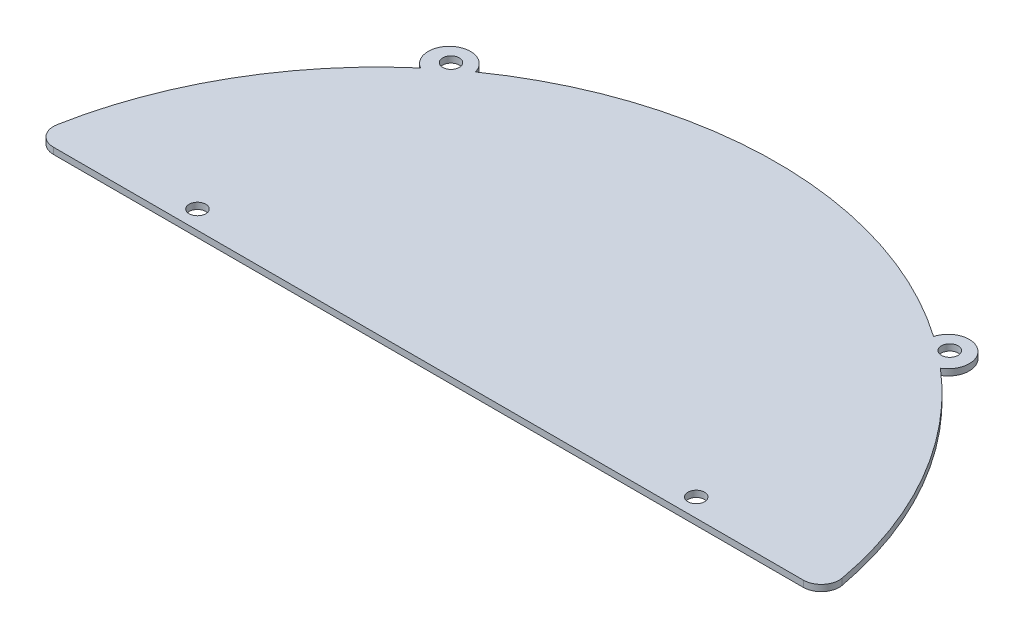
ISO-10303-21;
HEADER;
FILE_DESCRIPTION(('STEP AP214'),'2;1');
FILE_NAME('part.step','',(''),(''),'','','');
FILE_SCHEMA(('AUTOMOTIVE_DESIGN { 1 0 10303 214 1 1 1 1 }'));
ENDSEC;
DATA;
#1=APPLICATION_CONTEXT('core data for automotive mechanical design processes');
#2=APPLICATION_PROTOCOL_DEFINITION('international standard','automotive_design',2000,#1);
#3=PRODUCT_CONTEXT('',#1,'mechanical');
#4=PRODUCT('Part','Part','',(#3));
#5=PRODUCT_RELATED_PRODUCT_CATEGORY('part','',(#4));
#6=PRODUCT_DEFINITION_FORMATION('','',#4);
#7=PRODUCT_DEFINITION_CONTEXT('part definition',#1,'design');
#8=PRODUCT_DEFINITION('design','',#6,#7);
#9=PRODUCT_DEFINITION_SHAPE('','',#8);
#10=(LENGTH_UNIT() NAMED_UNIT(*) SI_UNIT(.MILLI.,.METRE.));
#11=(NAMED_UNIT(*) PLANE_ANGLE_UNIT() SI_UNIT($,.RADIAN.));
#12=(NAMED_UNIT(*) SI_UNIT($,.STERADIAN.) SOLID_ANGLE_UNIT());
#13=UNCERTAINTY_MEASURE_WITH_UNIT(LENGTH_MEASURE(1.E-05),#10,'distance_accuracy_value','');
#14=(GEOMETRIC_REPRESENTATION_CONTEXT(3) GLOBAL_UNCERTAINTY_ASSIGNED_CONTEXT((#13)) GLOBAL_UNIT_ASSIGNED_CONTEXT((#10,
#11,#12)) REPRESENTATION_CONTEXT('',''));
#15=CARTESIAN_POINT('',(0.,0.,0.));
#16=DIRECTION('',(0.,0.,1.));
#17=DIRECTION('',(1.,0.,0.));
#18=AXIS2_PLACEMENT_3D('',#15,#16,#17);
#19=CARTESIAN_POINT('',(0.,1.524,12.2093181818182));
#20=DIRECTION('',(0.,-1.,0.));
#21=DIRECTION('',(0.,0.,-1.));
#22=AXIS2_PLACEMENT_3D('',#19,#20,#21);
#23=CYLINDRICAL_SURFACE('',#22,96.0293181818182);
#24=DIRECTION('',(0.,1.,0.));
#25=VECTOR('',#24,1.);
#26=CARTESIAN_POINT('',(-62.5462288774261,-13.7542640313943,-60.6576784879877));
#27=LINE('',#26,#25);
#28=CARTESIAN_POINT('',(-62.5462288774262,0.,-60.6576784879876));
#29=VERTEX_POINT('',#28);
#30=CARTESIAN_POINT('',(-62.5462288774262,1.524,-60.6576784879876));
#31=VERTEX_POINT('',#30);
#32=EDGE_CURVE('E158',#29,#31,#27,.T.);
#33=ORIENTED_EDGE('',*,*,#32,.F.);
#34=CARTESIAN_POINT('',(0.,0.,12.2093181818182));
#35=DIRECTION('',(0.,-1.,0.));
#36=DIRECTION('',(0.,0.,-1.));
#37=AXIS2_PLACEMENT_3D('',#34,#35,#36);
#38=CIRCLE('',#37,96.0293181818182);
#39=CARTESIAN_POINT('',(-94.4571373578081,0.,-5.09614779379366));
#40=VERTEX_POINT('',#39);
#41=EDGE_CURVE('E132',#40,#29,#38,.T.);
#42=ORIENTED_EDGE('',*,*,#41,.F.);
#43=DIRECTION('',(0.,-1.,0.));
#44=VECTOR('',#43,1.);
#45=CARTESIAN_POINT('',(-94.457137357808,1.524,-5.09614779379366));
#46=LINE('',#45,#44);
#47=CARTESIAN_POINT('',(-94.4571373578081,1.524,-5.09614779379366));
#48=VERTEX_POINT('',#47);
#49=EDGE_CURVE('E179',#40,#48,#46,.F.);
#50=ORIENTED_EDGE('',*,*,#49,.T.);
#51=CARTESIAN_POINT('',(0.,1.524,12.2093181818182));
#52=DIRECTION('',(0.,-1.,0.));
#53=DIRECTION('',(0.,0.,-1.));
#54=AXIS2_PLACEMENT_3D('',#51,#52,#53);
#55=CIRCLE('',#54,96.0293181818182);
#56=EDGE_CURVE('E83',#48,#31,#55,.T.);
#57=ORIENTED_EDGE('',*,*,#56,.T.);
#58=EDGE_LOOP('',(#33,#42,#50,#57));
#59=FACE_BOUND('',#58,.T.);
#60=ADVANCED_FACE('F59',(#59),#23,.T.);
#61=DIRECTION('',(0.,1.,0.));
#62=VECTOR('',#61,1.);
#63=CARTESIAN_POINT('',(62.5462288774265,-13.7542640313943,-60.6576784879874));
#64=LINE('',#63,#62);
#65=CARTESIAN_POINT('',(62.5462288774264,0.,-60.6576784879875));
#66=VERTEX_POINT('',#65);
#67=CARTESIAN_POINT('',(62.5462288774265,1.524,-60.6576784879874));
#68=VERTEX_POINT('',#67);
#69=EDGE_CURVE('E168',#66,#68,#64,.T.);
#70=ORIENTED_EDGE('',*,*,#69,.T.);
#71=CARTESIAN_POINT('',(94.4571373578081,1.524,-5.0961477937937));
#72=VERTEX_POINT('',#71);
#73=EDGE_CURVE('E176',#68,#72,#55,.T.);
#74=ORIENTED_EDGE('',*,*,#73,.T.);
#75=DIRECTION('',(0.,-1.,0.));
#76=VECTOR('',#75,1.);
#77=CARTESIAN_POINT('',(94.457137357808,1.524,-5.0961477937937));
#78=LINE('',#77,#76);
#79=CARTESIAN_POINT('',(94.4571373578081,0.,-5.0961477937937));
#80=VERTEX_POINT('',#79);
#81=EDGE_CURVE('E188',#72,#80,#78,.T.);
#82=ORIENTED_EDGE('',*,*,#81,.T.);
#83=EDGE_CURVE('E133',#66,#80,#38,.T.);
#84=ORIENTED_EDGE('',*,*,#83,.F.);
#85=EDGE_LOOP('',(#70,#74,#82,#84));
#86=FACE_BOUND('',#85,.T.);
#87=ADVANCED_FACE('F271',(#86),#23,.T.);
#88=DIRECTION('',(0.,1.,0.));
#89=VECTOR('',#88,1.);
#90=CARTESIAN_POINT('',(-55.1106037191574,-13.7542640313943,-66.4319642859472));
#91=LINE('',#90,#89);
#92=CARTESIAN_POINT('',(-55.1106037191574,0.,-66.4319642859472));
#93=VERTEX_POINT('',#92);
#94=CARTESIAN_POINT('',(-55.1106037191573,1.524,-66.4319642859473));
#95=VERTEX_POINT('',#94);
#96=EDGE_CURVE('E75',#93,#95,#91,.T.);
#97=ORIENTED_EDGE('',*,*,#96,.T.);
#98=CARTESIAN_POINT('',(55.1106037191574,1.524,-66.4319642859472));
#99=VERTEX_POINT('',#98);
#100=EDGE_CURVE('E175',#95,#99,#55,.T.);
#101=ORIENTED_EDGE('',*,*,#100,.T.);
#102=DIRECTION('',(0.,1.,0.));
#103=VECTOR('',#102,1.);
#104=CARTESIAN_POINT('',(55.1106037191574,-13.7542640313943,-66.4319642859472));
#105=LINE('',#104,#103);
#106=CARTESIAN_POINT('',(55.1106037191574,0.,-66.4319642859472));
#107=VERTEX_POINT('',#106);
#108=EDGE_CURVE('E126',#107,#99,#105,.T.);
#109=ORIENTED_EDGE('',*,*,#108,.F.);
#110=EDGE_CURVE('E123',#93,#107,#38,.T.);
#111=ORIENTED_EDGE('',*,*,#110,.F.);
#112=EDGE_LOOP('',(#97,#101,#109,#111));
#113=FACE_BOUND('',#112,.T.);
#114=ADVANCED_FACE('F124',(#113),#23,.T.);
#115=CARTESIAN_POINT('',(-95.25,1.524,0.));
#116=DIRECTION('',(0.,0.,-1.));
#117=DIRECTION('',(-1.,0.,0.));
#118=AXIS2_PLACEMENT_3D('',#115,#116,#117);
#119=PLANE('',#118);
#120=DIRECTION('',(1.,0.,0.));
#121=VECTOR('',#120,1.);
#122=CARTESIAN_POINT('',(-95.25,0.,0.));
#123=LINE('',#122,#121);
#124=CARTESIAN_POINT('',(-90.2098311513974,0.,0.));
#125=VERTEX_POINT('',#124);
#126=CARTESIAN_POINT('',(90.2098311513974,0.,0.));
#127=VERTEX_POINT('',#126);
#128=EDGE_CURVE('E182',#125,#127,#123,.T.);
#129=ORIENTED_EDGE('',*,*,#128,.T.);
#130=DIRECTION('',(0.,1.,0.));
#131=VECTOR('',#130,1.);
#132=CARTESIAN_POINT('',(90.2098311513974,1.524,0.));
#133=LINE('',#132,#131);
#134=CARTESIAN_POINT('',(90.2098311513974,1.524,0.));
#135=VERTEX_POINT('',#134);
#136=EDGE_CURVE('E202',#127,#135,#133,.T.);
#137=ORIENTED_EDGE('',*,*,#136,.T.);
#138=DIRECTION('',(1.,0.,0.));
#139=VECTOR('',#138,1.);
#140=CARTESIAN_POINT('',(-95.25,1.524,0.));
#141=LINE('',#140,#139);
#142=CARTESIAN_POINT('',(-90.2098311513974,1.524,0.));
#143=VERTEX_POINT('',#142);
#144=EDGE_CURVE('E174',#143,#135,#141,.T.);
#145=ORIENTED_EDGE('',*,*,#144,.F.);
#146=DIRECTION('',(0.,1.,0.));
#147=VECTOR('',#146,1.);
#148=CARTESIAN_POINT('',(-90.2098311513974,0.,0.));
#149=LINE('',#148,#147);
#150=EDGE_CURVE('E198',#143,#125,#149,.F.);
#151=ORIENTED_EDGE('',*,*,#150,.T.);
#152=EDGE_LOOP('',(#129,#137,#145,#151));
#153=FACE_BOUND('',#152,.T.);
#154=ADVANCED_FACE('F214',(#153),#119,.F.);
#155=CARTESIAN_POINT('',(0.,1.524,12.2093181818182));
#156=DIRECTION('',(0.,-1.,0.));
#157=DIRECTION('',(0.,0.,-1.));
#158=AXIS2_PLACEMENT_3D('',#155,#156,#157);
#159=PLANE('',#158);
#160=CARTESIAN_POINT('',(60.,1.524,-65.4450000000001));
#161=DIRECTION('',(0.,1.,0.));
#162=DIRECTION('',(0.,0.,-1.));
#163=AXIS2_PLACEMENT_3D('',#160,#161,#162);
#164=CIRCLE('',#163,2.);
#165=CARTESIAN_POINT('',(60.,1.524,-63.4450000000001));
#166=VERTEX_POINT('',#165);
#167=EDGE_CURVE('E227',#166,#166,#164,.T.);
#168=ORIENTED_EDGE('',*,*,#167,.F.);
#169=EDGE_LOOP('',(#168));
#170=FACE_BOUND('',#169,.T.);
#171=CARTESIAN_POINT('',(-60.,1.524,-4.44500000000005));
#172=DIRECTION('',(0.,1.,0.));
#173=DIRECTION('',(0.,0.,-1.));
#174=AXIS2_PLACEMENT_3D('',#171,#172,#173);
#175=CIRCLE('',#174,2.);
#176=CARTESIAN_POINT('',(-60.,1.524,-2.44500000000004));
#177=VERTEX_POINT('',#176);
#178=EDGE_CURVE('E235',#177,#177,#175,.T.);
#179=ORIENTED_EDGE('',*,*,#178,.F.);
#180=EDGE_LOOP('',(#179));
#181=FACE_BOUND('',#180,.T.);
#182=CARTESIAN_POINT('',(60.,1.524,-4.44500000000006));
#183=DIRECTION('',(0.,1.,0.));
#184=DIRECTION('',(0.,0.,1.));
#185=AXIS2_PLACEMENT_3D('',#182,#183,#184);
#186=CIRCLE('',#185,2.);
#187=CARTESIAN_POINT('',(60.,1.524,-2.44500000000006));
#188=VERTEX_POINT('',#187);
#189=EDGE_CURVE('E221',#188,#188,#186,.T.);
#190=ORIENTED_EDGE('',*,*,#189,.F.);
#191=EDGE_LOOP('',(#190));
#192=FACE_BOUND('',#191,.T.);
#193=CARTESIAN_POINT('',(-60.,1.524,-65.4450000000001));
#194=DIRECTION('',(0.,1.,0.));
#195=DIRECTION('',(0.,0.,1.));
#196=AXIS2_PLACEMENT_3D('',#193,#194,#195);
#197=CIRCLE('',#196,2.);
#198=CARTESIAN_POINT('',(-60.,1.524,-63.445));
#199=VERTEX_POINT('',#198);
#200=EDGE_CURVE('E152',#199,#199,#197,.T.);
#201=ORIENTED_EDGE('',*,*,#200,.F.);
#202=EDGE_LOOP('',(#201));
#203=FACE_BOUND('',#202,.T.);
#204=ORIENTED_EDGE('',*,*,#100,.F.);
#205=CARTESIAN_POINT('',(-60.,1.524,-65.0534854109267));
#206=DIRECTION('',(0.,1.,0.));
#207=DIRECTION('',(0.,0.,1.));
#208=AXIS2_PLACEMENT_3D('',#205,#206,#207);
#209=CIRCLE('',#208,5.08);
#210=EDGE_CURVE('E141',#31,#95,#209,.F.);
#211=ORIENTED_EDGE('',*,*,#210,.F.);
#212=ORIENTED_EDGE('',*,*,#56,.F.);
#213=CARTESIAN_POINT('',(-90.2098311513974,1.524,-4.31799999999999));
#214=DIRECTION('',(0.,-1.,0.));
#215=DIRECTION('',(0.,0.,-1.));
#216=AXIS2_PLACEMENT_3D('',#213,#214,#215);
#217=CIRCLE('',#216,4.318);
#218=EDGE_CURVE('E68',#48,#143,#217,.F.);
#219=ORIENTED_EDGE('',*,*,#218,.T.);
#220=ORIENTED_EDGE('',*,*,#144,.T.);
#221=CARTESIAN_POINT('',(90.2098311513974,1.524,-4.31800000000003));
#222=DIRECTION('',(0.,-1.,0.));
#223=DIRECTION('',(0.,0.,-1.));
#224=AXIS2_PLACEMENT_3D('',#221,#222,#223);
#225=CIRCLE('',#224,4.318);
#226=EDGE_CURVE('E12',#135,#72,#225,.F.);
#227=ORIENTED_EDGE('',*,*,#226,.T.);
#228=ORIENTED_EDGE('',*,*,#73,.F.);
#229=CARTESIAN_POINT('',(60.,1.524,-65.0534854109267));
#230=DIRECTION('',(0.,1.,0.));
#231=DIRECTION('',(0.,0.,1.));
#232=AXIS2_PLACEMENT_3D('',#229,#230,#231);
#233=CIRCLE('',#232,5.08);
#234=EDGE_CURVE('E159',#68,#99,#233,.T.);
#235=ORIENTED_EDGE('',*,*,#234,.T.);
#236=EDGE_LOOP('',(#204,#211,#212,#219,#220,#227,#228,#235));
#237=FACE_BOUND('',#236,.T.);
#238=ADVANCED_FACE('F208',(#170,#181,#192,#203,#237),#159,.F.);
#239=CARTESIAN_POINT('',(0.,0.,12.2093181818182));
#240=DIRECTION('',(0.,-1.,0.));
#241=DIRECTION('',(0.,0.,-1.));
#242=AXIS2_PLACEMENT_3D('',#239,#240,#241);
#243=PLANE('',#242);
#244=CARTESIAN_POINT('',(60.,0.,-65.4450000000001));
#245=DIRECTION('',(0.,1.,0.));
#246=DIRECTION('',(0.,0.,-1.));
#247=AXIS2_PLACEMENT_3D('',#244,#245,#246);
#248=CIRCLE('',#247,2.);
#249=CARTESIAN_POINT('',(60.,0.,-63.4450000000001));
#250=VERTEX_POINT('',#249);
#251=EDGE_CURVE('E223',#250,#250,#248,.T.);
#252=ORIENTED_EDGE('',*,*,#251,.T.);
#253=EDGE_LOOP('',(#252));
#254=FACE_BOUND('',#253,.T.);
#255=CARTESIAN_POINT('',(-60.,0.,-4.44500000000005));
#256=DIRECTION('',(0.,1.,0.));
#257=DIRECTION('',(0.,0.,-1.));
#258=AXIS2_PLACEMENT_3D('',#255,#256,#257);
#259=CIRCLE('',#258,2.);
#260=CARTESIAN_POINT('',(-60.,0.,-2.44500000000004));
#261=VERTEX_POINT('',#260);
#262=EDGE_CURVE('E231',#261,#261,#259,.T.);
#263=ORIENTED_EDGE('',*,*,#262,.T.);
#264=EDGE_LOOP('',(#263));
#265=FACE_BOUND('',#264,.T.);
#266=CARTESIAN_POINT('',(60.,0.,-4.44500000000006));
#267=DIRECTION('',(0.,1.,0.));
#268=DIRECTION('',(0.,0.,1.));
#269=AXIS2_PLACEMENT_3D('',#266,#267,#268);
#270=CIRCLE('',#269,2.);
#271=CARTESIAN_POINT('',(60.,0.,-2.44500000000006));
#272=VERTEX_POINT('',#271);
#273=EDGE_CURVE('E239',#272,#272,#270,.T.);
#274=ORIENTED_EDGE('',*,*,#273,.T.);
#275=EDGE_LOOP('',(#274));
#276=FACE_BOUND('',#275,.T.);
#277=CARTESIAN_POINT('',(-60.,0.,-65.4450000000001));
#278=DIRECTION('',(0.,1.,0.));
#279=DIRECTION('',(0.,0.,1.));
#280=AXIS2_PLACEMENT_3D('',#277,#278,#279);
#281=CIRCLE('',#280,2.);
#282=CARTESIAN_POINT('',(-60.,0.,-63.445));
#283=VERTEX_POINT('',#282);
#284=EDGE_CURVE('E148',#283,#283,#281,.T.);
#285=ORIENTED_EDGE('',*,*,#284,.T.);
#286=EDGE_LOOP('',(#285));
#287=FACE_BOUND('',#286,.T.);
#288=ORIENTED_EDGE('',*,*,#41,.T.);
#289=CARTESIAN_POINT('',(-60.,0.,-65.0534854109267));
#290=DIRECTION('',(0.,-1.,0.));
#291=DIRECTION('',(0.,0.,-1.));
#292=AXIS2_PLACEMENT_3D('',#289,#290,#291);
#293=CIRCLE('',#292,5.08);
#294=EDGE_CURVE('E139',#29,#93,#293,.T.);
#295=ORIENTED_EDGE('',*,*,#294,.T.);
#296=ORIENTED_EDGE('',*,*,#110,.T.);
#297=CARTESIAN_POINT('',(60.,0.,-65.0534854109267));
#298=DIRECTION('',(0.,-1.,0.));
#299=DIRECTION('',(0.,0.,-1.));
#300=AXIS2_PLACEMENT_3D('',#297,#298,#299);
#301=CIRCLE('',#300,5.08);
#302=EDGE_CURVE('E163',#66,#107,#301,.F.);
#303=ORIENTED_EDGE('',*,*,#302,.F.);
#304=ORIENTED_EDGE('',*,*,#83,.T.);
#305=CARTESIAN_POINT('',(90.2098311513974,0.,-4.31800000000003));
#306=DIRECTION('',(0.,-1.,0.));
#307=DIRECTION('',(0.,0.,-1.));
#308=AXIS2_PLACEMENT_3D('',#305,#306,#307);
#309=CIRCLE('',#308,4.318);
#310=EDGE_CURVE('E195',#80,#127,#309,.T.);
#311=ORIENTED_EDGE('',*,*,#310,.T.);
#312=ORIENTED_EDGE('',*,*,#128,.F.);
#313=CARTESIAN_POINT('',(-90.2098311513974,0.,-4.31799999999999));
#314=DIRECTION('',(0.,-1.,0.));
#315=DIRECTION('',(0.,0.,-1.));
#316=AXIS2_PLACEMENT_3D('',#313,#314,#315);
#317=CIRCLE('',#316,4.318);
#318=EDGE_CURVE('E192',#125,#40,#317,.T.);
#319=ORIENTED_EDGE('',*,*,#318,.T.);
#320=EDGE_LOOP('',(#288,#295,#296,#303,#304,#311,#312,#319));
#321=FACE_BOUND('',#320,.T.);
#322=ADVANCED_FACE('F145',(#254,#265,#276,#287,#321),#243,.T.);
#323=CARTESIAN_POINT('',(90.2098311513974,1.524,-4.31800000000003));
#324=DIRECTION('',(0.,-1.,0.));
#325=DIRECTION('',(0.,0.,-1.));
#326=AXIS2_PLACEMENT_3D('',#323,#324,#325);
#327=CYLINDRICAL_SURFACE('',#326,4.318);
#328=ORIENTED_EDGE('',*,*,#226,.F.);
#329=ORIENTED_EDGE('',*,*,#136,.F.);
#330=ORIENTED_EDGE('',*,*,#310,.F.);
#331=ORIENTED_EDGE('',*,*,#81,.F.);
#332=EDGE_LOOP('',(#328,#329,#330,#331));
#333=FACE_BOUND('',#332,.T.);
#334=ADVANCED_FACE('F286',(#333),#327,.T.);
#335=CARTESIAN_POINT('',(-90.2098311513974,1.524,-4.31799999999999));
#336=DIRECTION('',(0.,-1.,0.));
#337=DIRECTION('',(0.,0.,-1.));
#338=AXIS2_PLACEMENT_3D('',#335,#336,#337);
#339=CYLINDRICAL_SURFACE('',#338,4.318);
#340=ORIENTED_EDGE('',*,*,#218,.F.);
#341=ORIENTED_EDGE('',*,*,#49,.F.);
#342=ORIENTED_EDGE('',*,*,#318,.F.);
#343=ORIENTED_EDGE('',*,*,#150,.F.);
#344=EDGE_LOOP('',(#340,#341,#342,#343));
#345=FACE_BOUND('',#344,.T.);
#346=ADVANCED_FACE('F61',(#345),#339,.T.);
#347=CARTESIAN_POINT('',(60.,-13.7542640313943,-65.0534854109267));
#348=DIRECTION('',(0.,1.,0.));
#349=DIRECTION('',(0.,0.,1.));
#350=AXIS2_PLACEMENT_3D('',#347,#348,#349);
#351=CYLINDRICAL_SURFACE('',#350,5.08);
#352=ORIENTED_EDGE('',*,*,#69,.F.);
#353=ORIENTED_EDGE('',*,*,#302,.T.);
#354=ORIENTED_EDGE('',*,*,#108,.T.);
#355=ORIENTED_EDGE('',*,*,#234,.F.);
#356=EDGE_LOOP('',(#352,#353,#354,#355));
#357=FACE_BOUND('',#356,.T.);
#358=ADVANCED_FACE('F266',(#357),#351,.T.);
#359=CARTESIAN_POINT('',(-60.,-13.7542640313943,-65.0534854109267));
#360=DIRECTION('',(0.,1.,0.));
#361=DIRECTION('',(0.,0.,1.));
#362=AXIS2_PLACEMENT_3D('',#359,#360,#361);
#363=CYLINDRICAL_SURFACE('',#362,5.08);
#364=ORIENTED_EDGE('',*,*,#294,.F.);
#365=ORIENTED_EDGE('',*,*,#32,.T.);
#366=ORIENTED_EDGE('',*,*,#210,.T.);
#367=ORIENTED_EDGE('',*,*,#96,.F.);
#368=EDGE_LOOP('',(#364,#365,#366,#367));
#369=FACE_BOUND('',#368,.T.);
#370=ADVANCED_FACE('F138',(#369),#363,.T.);
#371=CARTESIAN_POINT('',(-60.,0.,-65.4450000000001));
#372=DIRECTION('',(0.,1.,0.));
#373=DIRECTION('',(0.,0.,1.));
#374=AXIS2_PLACEMENT_3D('',#371,#372,#373);
#375=CYLINDRICAL_SURFACE('',#374,2.);
#376=CARTESIAN_POINT('',(-60.,0.,-63.445));
#377=CARTESIAN_POINT('',(-60.,0.015875,-63.445));
#378=CARTESIAN_POINT('',(-60.,0.03175,-63.445));
#379=CARTESIAN_POINT('',(-60.,0.0635,-63.445));
#380=CARTESIAN_POINT('',(-60.,0.079375,-63.445));
#381=CARTESIAN_POINT('',(-60.,0.111125,-63.445));
#382=CARTESIAN_POINT('',(-60.,0.127,-63.445));
#383=CARTESIAN_POINT('',(-60.,0.15875,-63.445));
#384=CARTESIAN_POINT('',(-60.,0.174625,-63.445));
#385=CARTESIAN_POINT('',(-60.,0.206375,-63.445));
#386=CARTESIAN_POINT('',(-60.,0.22225,-63.445));
#387=CARTESIAN_POINT('',(-60.,0.254,-63.445));
#388=CARTESIAN_POINT('',(-60.,0.269875,-63.445));
#389=CARTESIAN_POINT('',(-60.,0.301625,-63.445));
#390=CARTESIAN_POINT('',(-60.,0.3175,-63.445));
#391=CARTESIAN_POINT('',(-60.,0.34925,-63.445));
#392=CARTESIAN_POINT('',(-60.,0.365125,-63.445));
#393=CARTESIAN_POINT('',(-60.,0.396875,-63.445));
#394=CARTESIAN_POINT('',(-60.,0.41275,-63.445));
#395=CARTESIAN_POINT('',(-60.,0.4445,-63.445));
#396=CARTESIAN_POINT('',(-60.,0.460375,-63.445));
#397=CARTESIAN_POINT('',(-60.,0.492125,-63.445));
#398=CARTESIAN_POINT('',(-60.,0.508,-63.445));
#399=CARTESIAN_POINT('',(-60.,0.53975,-63.445));
#400=CARTESIAN_POINT('',(-60.,0.555625,-63.445));
#401=CARTESIAN_POINT('',(-60.,0.587375,-63.445));
#402=CARTESIAN_POINT('',(-60.,0.60325,-63.445));
#403=CARTESIAN_POINT('',(-60.,0.635,-63.445));
#404=CARTESIAN_POINT('',(-60.,0.650875,-63.445));
#405=CARTESIAN_POINT('',(-60.,0.682625,-63.445));
#406=CARTESIAN_POINT('',(-60.,0.6985,-63.445));
#407=CARTESIAN_POINT('',(-60.,0.73025,-63.445));
#408=CARTESIAN_POINT('',(-60.,0.746125,-63.445));
#409=CARTESIAN_POINT('',(-60.,0.777875,-63.445));
#410=CARTESIAN_POINT('',(-60.,0.79375,-63.445));
#411=CARTESIAN_POINT('',(-60.,0.8255,-63.445));
#412=CARTESIAN_POINT('',(-60.,0.841375,-63.445));
#413=CARTESIAN_POINT('',(-60.,0.873125,-63.445));
#414=CARTESIAN_POINT('',(-60.,0.889,-63.445));
#415=CARTESIAN_POINT('',(-60.,0.92075,-63.445));
#416=CARTESIAN_POINT('',(-60.,0.936625,-63.445));
#417=CARTESIAN_POINT('',(-60.,0.968375,-63.445));
#418=CARTESIAN_POINT('',(-60.,0.98425,-63.445));
#419=CARTESIAN_POINT('',(-60.,1.016,-63.445));
#420=CARTESIAN_POINT('',(-60.,1.031875,-63.445));
#421=CARTESIAN_POINT('',(-60.,1.063625,-63.445));
#422=CARTESIAN_POINT('',(-60.,1.0795,-63.445));
#423=CARTESIAN_POINT('',(-60.,1.11125,-63.445));
#424=CARTESIAN_POINT('',(-60.,1.127125,-63.445));
#425=CARTESIAN_POINT('',(-60.,1.158875,-63.445));
#426=CARTESIAN_POINT('',(-60.,1.17475,-63.445));
#427=CARTESIAN_POINT('',(-60.,1.2065,-63.445));
#428=CARTESIAN_POINT('',(-60.,1.222375,-63.445));
#429=CARTESIAN_POINT('',(-60.,1.254125,-63.445));
#430=CARTESIAN_POINT('',(-60.,1.27,-63.445));
#431=CARTESIAN_POINT('',(-60.,1.30175,-63.445));
#432=CARTESIAN_POINT('',(-60.,1.317625,-63.445));
#433=CARTESIAN_POINT('',(-60.,1.349375,-63.445));
#434=CARTESIAN_POINT('',(-60.,1.36525,-63.445));
#435=CARTESIAN_POINT('',(-60.,1.397,-63.445));
#436=CARTESIAN_POINT('',(-60.,1.412875,-63.445));
#437=CARTESIAN_POINT('',(-60.,1.444625,-63.445));
#438=CARTESIAN_POINT('',(-60.,1.4605,-63.445));
#439=CARTESIAN_POINT('',(-60.,1.49225,-63.445));
#440=CARTESIAN_POINT('',(-60.,1.508125,-63.445));
#441=CARTESIAN_POINT('',(-60.,1.524,-63.445));
#442=B_SPLINE_CURVE_WITH_KNOTS('',3,(#376,#377,#378,#379,#380,#381,#382,#383,#384,#385,#386,
#387,#388,#389,#390,#391,#392,#393,#394,#395,#396,#397,#398,#399,#400,#401,#402,#403,#404,#405,
#406,#407,#408,#409,#410,#411,#412,#413,#414,#415,#416,#417,#418,#419,#420,#421,#422,#423,#424,
#425,#426,#427,#428,#429,#430,#431,#432,#433,#434,#435,#436,#437,#438,#439,#440,#441),
.UNSPECIFIED.,.F.,.F.,(4,2,2,2,2,2,2,2,2,2,2,2,2,2,2,2,2,2,2,2,2,2,2,2,2,2,2,2,2,2,2,2,4),(0.,
0.047625,0.09525,0.142875,0.1905,0.238125,0.28575,0.333375,0.381,0.428625,0.47625,0.523875,
0.5715,0.619125,0.66675,0.714375,0.762,0.809625,0.85725,0.904875,0.9525,1.000125,1.04775,
1.095375,1.143,1.190625,1.23825,1.285875,1.3335,1.381125,1.42875,1.476375,1.524),.UNSPECIFIED.);
#443=EDGE_CURVE('BSEAM255',#283,#199,#442,.T.);
#444=ORIENTED_EDGE('',*,*,#284,.F.);
#445=ORIENTED_EDGE('',*,*,#200,.T.);
#446=ORIENTED_EDGE('',*,*,#443,.T.);
#447=ORIENTED_EDGE('',*,*,#443,.F.);
#448=EDGE_LOOP('',(#444,#446,#445,#447));
#449=FACE_BOUND('',#448,.T.);
#450=ADVANCED_FACE('F255',(#449),#375,.F.);
#451=CARTESIAN_POINT('',(60.,0.,-4.44500000000006));
#452=DIRECTION('',(0.,1.,0.));
#453=DIRECTION('',(0.,0.,1.));
#454=AXIS2_PLACEMENT_3D('',#451,#452,#453);
#455=CYLINDRICAL_SURFACE('',#454,2.);
#456=CARTESIAN_POINT('',(60.,0.,-2.44500000000006));
#457=CARTESIAN_POINT('',(60.,0.015875,-2.44500000000006));
#458=CARTESIAN_POINT('',(60.,0.03175,-2.44500000000006));
#459=CARTESIAN_POINT('',(60.,0.0635,-2.44500000000006));
#460=CARTESIAN_POINT('',(60.,0.079375,-2.44500000000006));
#461=CARTESIAN_POINT('',(60.,0.111125,-2.44500000000006));
#462=CARTESIAN_POINT('',(60.,0.127,-2.44500000000006));
#463=CARTESIAN_POINT('',(60.,0.15875,-2.44500000000006));
#464=CARTESIAN_POINT('',(60.,0.174625,-2.44500000000006));
#465=CARTESIAN_POINT('',(60.,0.206375,-2.44500000000006));
#466=CARTESIAN_POINT('',(60.,0.22225,-2.44500000000006));
#467=CARTESIAN_POINT('',(60.,0.254,-2.44500000000006));
#468=CARTESIAN_POINT('',(60.,0.269875,-2.44500000000006));
#469=CARTESIAN_POINT('',(60.,0.301625,-2.44500000000006));
#470=CARTESIAN_POINT('',(60.,0.3175,-2.44500000000006));
#471=CARTESIAN_POINT('',(60.,0.34925,-2.44500000000006));
#472=CARTESIAN_POINT('',(60.,0.365125,-2.44500000000006));
#473=CARTESIAN_POINT('',(60.,0.396875,-2.44500000000006));
#474=CARTESIAN_POINT('',(60.,0.41275,-2.44500000000006));
#475=CARTESIAN_POINT('',(60.,0.4445,-2.44500000000006));
#476=CARTESIAN_POINT('',(60.,0.460375,-2.44500000000006));
#477=CARTESIAN_POINT('',(60.,0.492125,-2.44500000000006));
#478=CARTESIAN_POINT('',(60.,0.508,-2.44500000000006));
#479=CARTESIAN_POINT('',(60.,0.53975,-2.44500000000006));
#480=CARTESIAN_POINT('',(60.,0.555625,-2.44500000000006));
#481=CARTESIAN_POINT('',(60.,0.587375,-2.44500000000006));
#482=CARTESIAN_POINT('',(60.,0.60325,-2.44500000000006));
#483=CARTESIAN_POINT('',(60.,0.635,-2.44500000000006));
#484=CARTESIAN_POINT('',(60.,0.650875,-2.44500000000006));
#485=CARTESIAN_POINT('',(60.,0.682625,-2.44500000000006));
#486=CARTESIAN_POINT('',(60.,0.6985,-2.44500000000006));
#487=CARTESIAN_POINT('',(60.,0.73025,-2.44500000000006));
#488=CARTESIAN_POINT('',(60.,0.746125,-2.44500000000006));
#489=CARTESIAN_POINT('',(60.,0.777875,-2.44500000000006));
#490=CARTESIAN_POINT('',(60.,0.79375,-2.44500000000006));
#491=CARTESIAN_POINT('',(60.,0.8255,-2.44500000000006));
#492=CARTESIAN_POINT('',(60.,0.841375,-2.44500000000006));
#493=CARTESIAN_POINT('',(60.,0.873125,-2.44500000000006));
#494=CARTESIAN_POINT('',(60.,0.889,-2.44500000000006));
#495=CARTESIAN_POINT('',(60.,0.92075,-2.44500000000006));
#496=CARTESIAN_POINT('',(60.,0.936625,-2.44500000000006));
#497=CARTESIAN_POINT('',(60.,0.968375,-2.44500000000006));
#498=CARTESIAN_POINT('',(60.,0.98425,-2.44500000000006));
#499=CARTESIAN_POINT('',(60.,1.016,-2.44500000000006));
#500=CARTESIAN_POINT('',(60.,1.031875,-2.44500000000006));
#501=CARTESIAN_POINT('',(60.,1.063625,-2.44500000000006));
#502=CARTESIAN_POINT('',(60.,1.0795,-2.44500000000006));
#503=CARTESIAN_POINT('',(60.,1.11125,-2.44500000000006));
#504=CARTESIAN_POINT('',(60.,1.127125,-2.44500000000006));
#505=CARTESIAN_POINT('',(60.,1.158875,-2.44500000000006));
#506=CARTESIAN_POINT('',(60.,1.17475,-2.44500000000006));
#507=CARTESIAN_POINT('',(60.,1.2065,-2.44500000000006));
#508=CARTESIAN_POINT('',(60.,1.222375,-2.44500000000006));
#509=CARTESIAN_POINT('',(60.,1.254125,-2.44500000000006));
#510=CARTESIAN_POINT('',(60.,1.27,-2.44500000000006));
#511=CARTESIAN_POINT('',(60.,1.30175,-2.44500000000006));
#512=CARTESIAN_POINT('',(60.,1.317625,-2.44500000000006));
#513=CARTESIAN_POINT('',(60.,1.349375,-2.44500000000006));
#514=CARTESIAN_POINT('',(60.,1.36525,-2.44500000000006));
#515=CARTESIAN_POINT('',(60.,1.397,-2.44500000000006));
#516=CARTESIAN_POINT('',(60.,1.412875,-2.44500000000006));
#517=CARTESIAN_POINT('',(60.,1.444625,-2.44500000000006));
#518=CARTESIAN_POINT('',(60.,1.4605,-2.44500000000006));
#519=CARTESIAN_POINT('',(60.,1.49225,-2.44500000000006));
#520=CARTESIAN_POINT('',(60.,1.508125,-2.44500000000006));
#521=CARTESIAN_POINT('',(60.,1.524,-2.44500000000006));
#522=B_SPLINE_CURVE_WITH_KNOTS('',3,(#456,#457,#458,#459,#460,#461,#462,#463,#464,#465,#466,
#467,#468,#469,#470,#471,#472,#473,#474,#475,#476,#477,#478,#479,#480,#481,#482,#483,#484,#485,
#486,#487,#488,#489,#490,#491,#492,#493,#494,#495,#496,#497,#498,#499,#500,#501,#502,#503,#504,
#505,#506,#507,#508,#509,#510,#511,#512,#513,#514,#515,#516,#517,#518,#519,#520,#521),
.UNSPECIFIED.,.F.,.F.,(4,2,2,2,2,2,2,2,2,2,2,2,2,2,2,2,2,2,2,2,2,2,2,2,2,2,2,2,2,2,2,2,4),(0.,
0.047625,0.09525,0.142875,0.1905,0.238125,0.28575,0.333375,0.381,0.428625,0.47625,0.523875,
0.5715,0.619125,0.66675,0.714375,0.762,0.809625,0.85725,0.904875,0.9525,1.000125,1.04775,
1.095375,1.143,1.190625,1.23825,1.285875,1.3335,1.381125,1.42875,1.476375,1.524),.UNSPECIFIED.);
#523=EDGE_CURVE('BSEAM247',#272,#188,#522,.T.);
#524=ORIENTED_EDGE('',*,*,#273,.F.);
#525=ORIENTED_EDGE('',*,*,#189,.T.);
#526=ORIENTED_EDGE('',*,*,#523,.T.);
#527=ORIENTED_EDGE('',*,*,#523,.F.);
#528=EDGE_LOOP('',(#524,#526,#525,#527));
#529=FACE_BOUND('',#528,.T.);
#530=ADVANCED_FACE('F247',(#529),#455,.F.);
#531=CARTESIAN_POINT('',(-60.,0.,-4.44500000000005));
#532=DIRECTION('',(0.,1.,0.));
#533=DIRECTION('',(0.,0.,1.));
#534=AXIS2_PLACEMENT_3D('',#531,#532,#533);
#535=CYLINDRICAL_SURFACE('',#534,2.);
#536=CARTESIAN_POINT('',(-60.,0.,-2.44500000000004));
#537=CARTESIAN_POINT('',(-60.,0.015875,-2.44500000000004));
#538=CARTESIAN_POINT('',(-60.,0.03175,-2.44500000000004));
#539=CARTESIAN_POINT('',(-60.,0.0635,-2.44500000000004));
#540=CARTESIAN_POINT('',(-60.,0.079375,-2.44500000000004));
#541=CARTESIAN_POINT('',(-60.,0.111125,-2.44500000000004));
#542=CARTESIAN_POINT('',(-60.,0.127,-2.44500000000004));
#543=CARTESIAN_POINT('',(-60.,0.15875,-2.44500000000004));
#544=CARTESIAN_POINT('',(-60.,0.174625,-2.44500000000004));
#545=CARTESIAN_POINT('',(-60.,0.206375,-2.44500000000004));
#546=CARTESIAN_POINT('',(-60.,0.22225,-2.44500000000004));
#547=CARTESIAN_POINT('',(-60.,0.254,-2.44500000000004));
#548=CARTESIAN_POINT('',(-60.,0.269875,-2.44500000000004));
#549=CARTESIAN_POINT('',(-60.,0.301625,-2.44500000000004));
#550=CARTESIAN_POINT('',(-60.,0.3175,-2.44500000000004));
#551=CARTESIAN_POINT('',(-60.,0.34925,-2.44500000000004));
#552=CARTESIAN_POINT('',(-60.,0.365125,-2.44500000000004));
#553=CARTESIAN_POINT('',(-60.,0.396875,-2.44500000000004));
#554=CARTESIAN_POINT('',(-60.,0.41275,-2.44500000000004));
#555=CARTESIAN_POINT('',(-60.,0.4445,-2.44500000000004));
#556=CARTESIAN_POINT('',(-60.,0.460375,-2.44500000000004));
#557=CARTESIAN_POINT('',(-60.,0.492125,-2.44500000000004));
#558=CARTESIAN_POINT('',(-60.,0.508,-2.44500000000004));
#559=CARTESIAN_POINT('',(-60.,0.53975,-2.44500000000004));
#560=CARTESIAN_POINT('',(-60.,0.555625,-2.44500000000004));
#561=CARTESIAN_POINT('',(-60.,0.587375,-2.44500000000004));
#562=CARTESIAN_POINT('',(-60.,0.60325,-2.44500000000004));
#563=CARTESIAN_POINT('',(-60.,0.635,-2.44500000000004));
#564=CARTESIAN_POINT('',(-60.,0.650875,-2.44500000000004));
#565=CARTESIAN_POINT('',(-60.,0.682625,-2.44500000000004));
#566=CARTESIAN_POINT('',(-60.,0.6985,-2.44500000000004));
#567=CARTESIAN_POINT('',(-60.,0.73025,-2.44500000000004));
#568=CARTESIAN_POINT('',(-60.,0.746125,-2.44500000000004));
#569=CARTESIAN_POINT('',(-60.,0.777875,-2.44500000000004));
#570=CARTESIAN_POINT('',(-60.,0.79375,-2.44500000000004));
#571=CARTESIAN_POINT('',(-60.,0.8255,-2.44500000000004));
#572=CARTESIAN_POINT('',(-60.,0.841375,-2.44500000000004));
#573=CARTESIAN_POINT('',(-60.,0.873125,-2.44500000000004));
#574=CARTESIAN_POINT('',(-60.,0.889,-2.44500000000004));
#575=CARTESIAN_POINT('',(-60.,0.92075,-2.44500000000004));
#576=CARTESIAN_POINT('',(-60.,0.936625,-2.44500000000004));
#577=CARTESIAN_POINT('',(-60.,0.968375,-2.44500000000004));
#578=CARTESIAN_POINT('',(-60.,0.98425,-2.44500000000004));
#579=CARTESIAN_POINT('',(-60.,1.016,-2.44500000000004));
#580=CARTESIAN_POINT('',(-60.,1.031875,-2.44500000000004));
#581=CARTESIAN_POINT('',(-60.,1.063625,-2.44500000000004));
#582=CARTESIAN_POINT('',(-60.,1.0795,-2.44500000000004));
#583=CARTESIAN_POINT('',(-60.,1.11125,-2.44500000000004));
#584=CARTESIAN_POINT('',(-60.,1.127125,-2.44500000000004));
#585=CARTESIAN_POINT('',(-60.,1.158875,-2.44500000000004));
#586=CARTESIAN_POINT('',(-60.,1.17475,-2.44500000000004));
#587=CARTESIAN_POINT('',(-60.,1.2065,-2.44500000000004));
#588=CARTESIAN_POINT('',(-60.,1.222375,-2.44500000000004));
#589=CARTESIAN_POINT('',(-60.,1.254125,-2.44500000000004));
#590=CARTESIAN_POINT('',(-60.,1.27,-2.44500000000004));
#591=CARTESIAN_POINT('',(-60.,1.30175,-2.44500000000004));
#592=CARTESIAN_POINT('',(-60.,1.317625,-2.44500000000004));
#593=CARTESIAN_POINT('',(-60.,1.349375,-2.44500000000004));
#594=CARTESIAN_POINT('',(-60.,1.36525,-2.44500000000004));
#595=CARTESIAN_POINT('',(-60.,1.397,-2.44500000000004));
#596=CARTESIAN_POINT('',(-60.,1.412875,-2.44500000000004));
#597=CARTESIAN_POINT('',(-60.,1.444625,-2.44500000000004));
#598=CARTESIAN_POINT('',(-60.,1.4605,-2.44500000000004));
#599=CARTESIAN_POINT('',(-60.,1.49225,-2.44500000000004));
#600=CARTESIAN_POINT('',(-60.,1.508125,-2.44500000000004));
#601=CARTESIAN_POINT('',(-60.,1.524,-2.44500000000004));
#602=B_SPLINE_CURVE_WITH_KNOTS('',3,(#536,#537,#538,#539,#540,#541,#542,#543,#544,#545,#546,
#547,#548,#549,#550,#551,#552,#553,#554,#555,#556,#557,#558,#559,#560,#561,#562,#563,#564,#565,
#566,#567,#568,#569,#570,#571,#572,#573,#574,#575,#576,#577,#578,#579,#580,#581,#582,#583,#584,
#585,#586,#587,#588,#589,#590,#591,#592,#593,#594,#595,#596,#597,#598,#599,#600,#601),
.UNSPECIFIED.,.F.,.F.,(4,2,2,2,2,2,2,2,2,2,2,2,2,2,2,2,2,2,2,2,2,2,2,2,2,2,2,2,2,2,2,2,4),(0.,
0.047625,0.09525,0.142875,0.1905,0.238125,0.28575,0.333375,0.381,0.428625,0.47625,0.523875,
0.5715,0.619125,0.66675,0.714375,0.762,0.809625,0.85725,0.904875,0.9525,1.000125,1.04775,
1.095375,1.143,1.190625,1.23825,1.285875,1.3335,1.381125,1.42875,1.476375,1.524),.UNSPECIFIED.);
#603=EDGE_CURVE('BSEAM263',#261,#177,#602,.T.);
#604=ORIENTED_EDGE('',*,*,#262,.F.);
#605=ORIENTED_EDGE('',*,*,#178,.T.);
#606=ORIENTED_EDGE('',*,*,#603,.T.);
#607=ORIENTED_EDGE('',*,*,#603,.F.);
#608=EDGE_LOOP('',(#604,#606,#605,#607));
#609=FACE_BOUND('',#608,.T.);
#610=ADVANCED_FACE('F263',(#609),#535,.F.);
#611=CARTESIAN_POINT('',(60.,0.,-65.4450000000001));
#612=DIRECTION('',(0.,1.,0.));
#613=DIRECTION('',(0.,0.,1.));
#614=AXIS2_PLACEMENT_3D('',#611,#612,#613);
#615=CYLINDRICAL_SURFACE('',#614,2.);
#616=CARTESIAN_POINT('',(60.,0.,-63.4450000000001));
#617=CARTESIAN_POINT('',(60.,0.015875,-63.4450000000001));
#618=CARTESIAN_POINT('',(60.,0.03175,-63.4450000000001));
#619=CARTESIAN_POINT('',(60.,0.0635,-63.4450000000001));
#620=CARTESIAN_POINT('',(60.,0.079375,-63.4450000000001));
#621=CARTESIAN_POINT('',(60.,0.111125,-63.4450000000001));
#622=CARTESIAN_POINT('',(60.,0.127,-63.4450000000001));
#623=CARTESIAN_POINT('',(60.,0.15875,-63.4450000000001));
#624=CARTESIAN_POINT('',(60.,0.174625,-63.4450000000001));
#625=CARTESIAN_POINT('',(60.,0.206375,-63.4450000000001));
#626=CARTESIAN_POINT('',(60.,0.22225,-63.4450000000001));
#627=CARTESIAN_POINT('',(60.,0.254,-63.4450000000001));
#628=CARTESIAN_POINT('',(60.,0.269875,-63.4450000000001));
#629=CARTESIAN_POINT('',(60.,0.301625,-63.4450000000001));
#630=CARTESIAN_POINT('',(60.,0.3175,-63.4450000000001));
#631=CARTESIAN_POINT('',(60.,0.34925,-63.4450000000001));
#632=CARTESIAN_POINT('',(60.,0.365125,-63.4450000000001));
#633=CARTESIAN_POINT('',(60.,0.396875,-63.4450000000001));
#634=CARTESIAN_POINT('',(60.,0.41275,-63.4450000000001));
#635=CARTESIAN_POINT('',(60.,0.4445,-63.4450000000001));
#636=CARTESIAN_POINT('',(60.,0.460375,-63.4450000000001));
#637=CARTESIAN_POINT('',(60.,0.492125,-63.4450000000001));
#638=CARTESIAN_POINT('',(60.,0.508,-63.4450000000001));
#639=CARTESIAN_POINT('',(60.,0.53975,-63.4450000000001));
#640=CARTESIAN_POINT('',(60.,0.555625,-63.4450000000001));
#641=CARTESIAN_POINT('',(60.,0.587375,-63.4450000000001));
#642=CARTESIAN_POINT('',(60.,0.60325,-63.4450000000001));
#643=CARTESIAN_POINT('',(60.,0.635,-63.4450000000001));
#644=CARTESIAN_POINT('',(60.,0.650875,-63.4450000000001));
#645=CARTESIAN_POINT('',(60.,0.682625,-63.4450000000001));
#646=CARTESIAN_POINT('',(60.,0.6985,-63.4450000000001));
#647=CARTESIAN_POINT('',(60.,0.73025,-63.4450000000001));
#648=CARTESIAN_POINT('',(60.,0.746125,-63.4450000000001));
#649=CARTESIAN_POINT('',(60.,0.777875,-63.4450000000001));
#650=CARTESIAN_POINT('',(60.,0.79375,-63.4450000000001));
#651=CARTESIAN_POINT('',(60.,0.8255,-63.4450000000001));
#652=CARTESIAN_POINT('',(60.,0.841375,-63.4450000000001));
#653=CARTESIAN_POINT('',(60.,0.873125,-63.4450000000001));
#654=CARTESIAN_POINT('',(60.,0.889,-63.4450000000001));
#655=CARTESIAN_POINT('',(60.,0.92075,-63.4450000000001));
#656=CARTESIAN_POINT('',(60.,0.936625,-63.4450000000001));
#657=CARTESIAN_POINT('',(60.,0.968375,-63.4450000000001));
#658=CARTESIAN_POINT('',(60.,0.98425,-63.4450000000001));
#659=CARTESIAN_POINT('',(60.,1.016,-63.4450000000001));
#660=CARTESIAN_POINT('',(60.,1.031875,-63.4450000000001));
#661=CARTESIAN_POINT('',(60.,1.063625,-63.4450000000001));
#662=CARTESIAN_POINT('',(60.,1.0795,-63.4450000000001));
#663=CARTESIAN_POINT('',(60.,1.11125,-63.4450000000001));
#664=CARTESIAN_POINT('',(60.,1.127125,-63.4450000000001));
#665=CARTESIAN_POINT('',(60.,1.158875,-63.4450000000001));
#666=CARTESIAN_POINT('',(60.,1.17475,-63.4450000000001));
#667=CARTESIAN_POINT('',(60.,1.2065,-63.4450000000001));
#668=CARTESIAN_POINT('',(60.,1.222375,-63.4450000000001));
#669=CARTESIAN_POINT('',(60.,1.254125,-63.4450000000001));
#670=CARTESIAN_POINT('',(60.,1.27,-63.4450000000001));
#671=CARTESIAN_POINT('',(60.,1.30175,-63.4450000000001));
#672=CARTESIAN_POINT('',(60.,1.317625,-63.4450000000001));
#673=CARTESIAN_POINT('',(60.,1.349375,-63.4450000000001));
#674=CARTESIAN_POINT('',(60.,1.36525,-63.4450000000001));
#675=CARTESIAN_POINT('',(60.,1.397,-63.4450000000001));
#676=CARTESIAN_POINT('',(60.,1.412875,-63.4450000000001));
#677=CARTESIAN_POINT('',(60.,1.444625,-63.4450000000001));
#678=CARTESIAN_POINT('',(60.,1.4605,-63.4450000000001));
#679=CARTESIAN_POINT('',(60.,1.49225,-63.4450000000001));
#680=CARTESIAN_POINT('',(60.,1.508125,-63.4450000000001));
#681=CARTESIAN_POINT('',(60.,1.524,-63.4450000000001));
#682=B_SPLINE_CURVE_WITH_KNOTS('',3,(#616,#617,#618,#619,#620,#621,#622,#623,#624,#625,#626,
#627,#628,#629,#630,#631,#632,#633,#634,#635,#636,#637,#638,#639,#640,#641,#642,#643,#644,#645,
#646,#647,#648,#649,#650,#651,#652,#653,#654,#655,#656,#657,#658,#659,#660,#661,#662,#663,#664,
#665,#666,#667,#668,#669,#670,#671,#672,#673,#674,#675,#676,#677,#678,#679,#680,#681),
.UNSPECIFIED.,.F.,.F.,(4,2,2,2,2,2,2,2,2,2,2,2,2,2,2,2,2,2,2,2,2,2,2,2,2,2,2,2,2,2,2,2,4),(0.,
0.047625,0.09525,0.142875,0.1905,0.238125,0.28575,0.333375,0.381,0.428625,0.47625,0.523875,
0.5715,0.619125,0.66675,0.714375,0.762,0.809625,0.85725,0.904875,0.9525,1.000125,1.04775,
1.095375,1.143,1.190625,1.23825,1.285875,1.3335,1.381125,1.42875,1.476375,1.524),.UNSPECIFIED.);
#683=EDGE_CURVE('BSEAM374',#250,#166,#682,.T.);
#684=ORIENTED_EDGE('',*,*,#251,.F.);
#685=ORIENTED_EDGE('',*,*,#167,.T.);
#686=ORIENTED_EDGE('',*,*,#683,.T.);
#687=ORIENTED_EDGE('',*,*,#683,.F.);
#688=EDGE_LOOP('',(#684,#686,#685,#687));
#689=FACE_BOUND('',#688,.T.);
#690=ADVANCED_FACE('F374',(#689),#615,.F.);
#691=CLOSED_SHELL('',(#60,#87,#114,#154,#238,#322,#334,#346,#358,#370,#450,#530,#610,#690));
#692=MANIFOLD_SOLID_BREP('B2',#691);
#693=ADVANCED_BREP_SHAPE_REPRESENTATION('',(#18,#692),#14);
#694=SHAPE_DEFINITION_REPRESENTATION(#9,#693);
ENDSEC;
END-ISO-10303-21;
